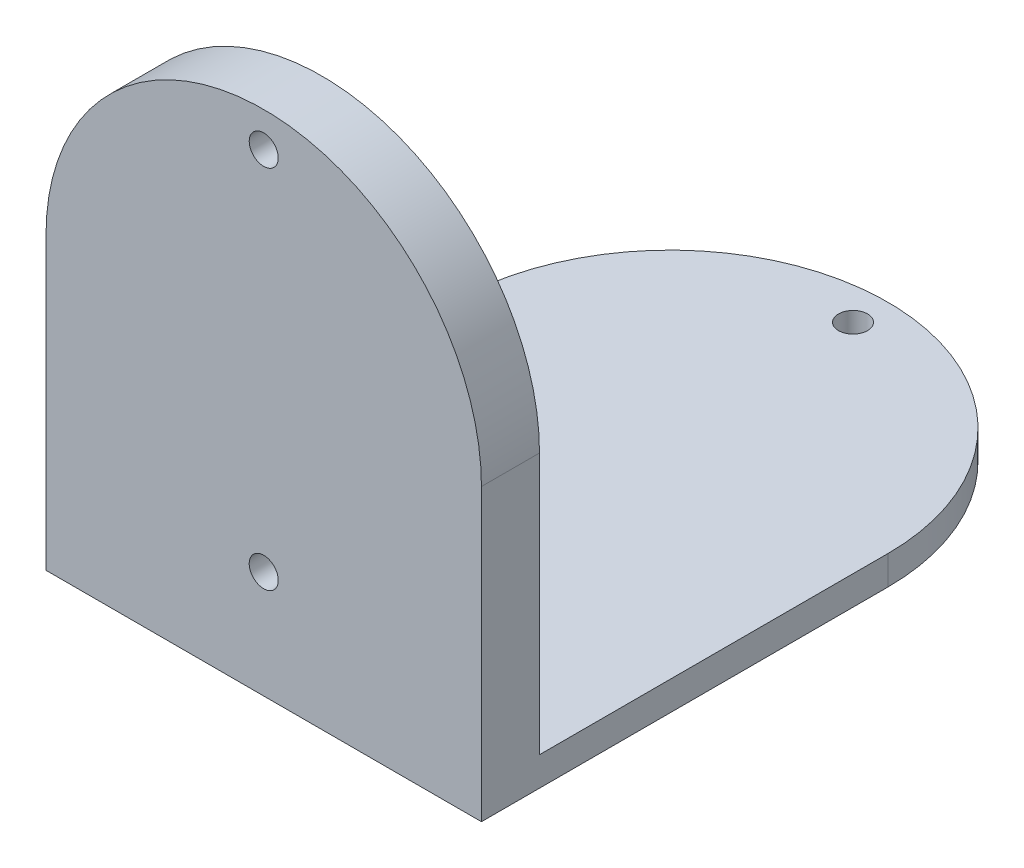
ISO-10303-21;
HEADER;
FILE_DESCRIPTION(('STEP AP214'),'2;1');
FILE_NAME('part.step','',(''),(''),'','','');
FILE_SCHEMA(('AUTOMOTIVE_DESIGN { 1 0 10303 214 1 1 1 1 }'));
ENDSEC;
DATA;
#1=APPLICATION_CONTEXT('core data for automotive mechanical design processes');
#2=APPLICATION_PROTOCOL_DEFINITION('international standard','automotive_design',2000,#1);
#3=PRODUCT_CONTEXT('',#1,'mechanical');
#4=PRODUCT('Part','Part','',(#3));
#5=PRODUCT_RELATED_PRODUCT_CATEGORY('part','',(#4));
#6=PRODUCT_DEFINITION_FORMATION('','',#4);
#7=PRODUCT_DEFINITION_CONTEXT('part definition',#1,'design');
#8=PRODUCT_DEFINITION('design','',#6,#7);
#9=PRODUCT_DEFINITION_SHAPE('','',#8);
#10=(LENGTH_UNIT() NAMED_UNIT(*) SI_UNIT(.MILLI.,.METRE.));
#11=(NAMED_UNIT(*) PLANE_ANGLE_UNIT() SI_UNIT($,.RADIAN.));
#12=(NAMED_UNIT(*) SI_UNIT($,.STERADIAN.) SOLID_ANGLE_UNIT());
#13=UNCERTAINTY_MEASURE_WITH_UNIT(LENGTH_MEASURE(1.E-05),#10,'distance_accuracy_value','');
#14=(GEOMETRIC_REPRESENTATION_CONTEXT(3) GLOBAL_UNCERTAINTY_ASSIGNED_CONTEXT((#13)) GLOBAL_UNIT_ASSIGNED_CONTEXT((#10,
#11,#12)) REPRESENTATION_CONTEXT('',''));
#15=CARTESIAN_POINT('',(0.,0.,0.));
#16=DIRECTION('',(0.,0.,1.));
#17=DIRECTION('',(1.,0.,0.));
#18=AXIS2_PLACEMENT_3D('',#15,#16,#17);
#19=CARTESIAN_POINT('',(0.,5.,0.));
#20=DIRECTION('',(0.,-1.,0.));
#21=DIRECTION('',(0.,0.,-1.));
#22=AXIS2_PLACEMENT_3D('',#19,#20,#21);
#23=PLANE('',#22);
#24=CARTESIAN_POINT('',(0.,5.,-31.5));
#25=DIRECTION('',(0.,1.,0.));
#26=DIRECTION('',(0.,0.,1.));
#27=AXIS2_PLACEMENT_3D('',#24,#25,#26);
#28=CIRCLE('',#27,2.5);
#29=CARTESIAN_POINT('',(0.,5.,-29.));
#30=VERTEX_POINT('',#29);
#31=EDGE_CURVE('E155',#30,#30,#28,.T.);
#32=ORIENTED_EDGE('',*,*,#31,.F.);
#33=EDGE_LOOP('',(#32));
#34=FACE_BOUND('',#33,.T.);
#35=CARTESIAN_POINT('',(0.,5.,31.5));
#36=DIRECTION('',(0.,1.,0.));
#37=DIRECTION('',(0.,0.,-1.));
#38=AXIS2_PLACEMENT_3D('',#35,#36,#37);
#39=CIRCLE('',#38,2.5);
#40=CARTESIAN_POINT('',(0.,5.,29.));
#41=VERTEX_POINT('',#40);
#42=EDGE_CURVE('E163',#41,#41,#39,.T.);
#43=ORIENTED_EDGE('',*,*,#42,.F.);
#44=EDGE_LOOP('',(#43));
#45=FACE_BOUND('',#44,.T.);
#46=DIRECTION('',(-1.,0.,0.));
#47=VECTOR('',#46,1.);
#48=CARTESIAN_POINT('',(-37.5,5.,60.));
#49=LINE('',#48,#47);
#50=CARTESIAN_POINT('',(37.5,5.,60.));
#51=VERTEX_POINT('',#50);
#52=CARTESIAN_POINT('',(-37.5,5.,60.));
#53=VERTEX_POINT('',#52);
#54=EDGE_CURVE('E55',#51,#53,#49,.T.);
#55=ORIENTED_EDGE('',*,*,#54,.F.);
#56=DIRECTION('',(0.,0.,-1.));
#57=VECTOR('',#56,1.);
#58=CARTESIAN_POINT('',(37.5,5.,70.));
#59=LINE('',#58,#57);
#60=CARTESIAN_POINT('',(37.5,5.,0.));
#61=VERTEX_POINT('',#60);
#62=EDGE_CURVE('E60',#51,#61,#59,.T.);
#63=ORIENTED_EDGE('',*,*,#62,.T.);
#64=CARTESIAN_POINT('',(0.,5.,0.));
#65=DIRECTION('',(0.,1.,0.));
#66=DIRECTION('',(0.,0.,-1.));
#67=AXIS2_PLACEMENT_3D('',#64,#65,#66);
#68=CIRCLE('',#67,37.5);
#69=CARTESIAN_POINT('',(-37.5,5.,0.));
#70=VERTEX_POINT('',#69);
#71=EDGE_CURVE('E92',#61,#70,#68,.T.);
#72=ORIENTED_EDGE('',*,*,#71,.T.);
#73=DIRECTION('',(0.,0.,1.));
#74=VECTOR('',#73,1.);
#75=CARTESIAN_POINT('',(-37.5,5.,0.));
#76=LINE('',#75,#74);
#77=EDGE_CURVE('E172',#70,#53,#76,.T.);
#78=ORIENTED_EDGE('',*,*,#77,.T.);
#79=EDGE_LOOP('',(#55,#63,#72,#78));
#80=FACE_BOUND('',#79,.T.);
#81=ADVANCED_FACE('F39',(#34,#45,#80),#23,.F.);
#82=CARTESIAN_POINT('',(0.,5.,0.));
#83=DIRECTION('',(0.,-1.,0.));
#84=DIRECTION('',(0.,0.,-1.));
#85=AXIS2_PLACEMENT_3D('',#82,#83,#84);
#86=CYLINDRICAL_SURFACE('',#85,37.5);
#87=CARTESIAN_POINT('',(0.,0.,0.));
#88=DIRECTION('',(0.,1.,0.));
#89=DIRECTION('',(0.,0.,-1.));
#90=AXIS2_PLACEMENT_3D('',#87,#88,#89);
#91=CIRCLE('',#90,37.5);
#92=CARTESIAN_POINT('',(37.5,0.,0.));
#93=VERTEX_POINT('',#92);
#94=CARTESIAN_POINT('',(-37.5,0.,0.));
#95=VERTEX_POINT('',#94);
#96=EDGE_CURVE('E98',#93,#95,#91,.T.);
#97=ORIENTED_EDGE('',*,*,#96,.T.);
#98=DIRECTION('',(0.,-1.,0.));
#99=VECTOR('',#98,1.);
#100=CARTESIAN_POINT('',(-37.5,5.,0.));
#101=LINE('',#100,#99);
#102=EDGE_CURVE('E11',#70,#95,#101,.T.);
#103=ORIENTED_EDGE('',*,*,#102,.F.);
#104=ORIENTED_EDGE('',*,*,#71,.F.);
#105=DIRECTION('',(0.,-1.,0.));
#106=VECTOR('',#105,1.);
#107=CARTESIAN_POINT('',(37.5,5.,0.));
#108=LINE('',#107,#106);
#109=EDGE_CURVE('E83',#61,#93,#108,.T.);
#110=ORIENTED_EDGE('',*,*,#109,.T.);
#111=EDGE_LOOP('',(#97,#103,#104,#110));
#112=FACE_BOUND('',#111,.T.);
#113=ADVANCED_FACE('F41',(#112),#86,.T.);
#114=CARTESIAN_POINT('',(-37.5,5.,0.));
#115=DIRECTION('',(1.,0.,0.));
#116=DIRECTION('',(0.,0.,-1.));
#117=AXIS2_PLACEMENT_3D('',#114,#115,#116);
#118=PLANE('',#117);
#119=DIRECTION('',(0.,0.,1.));
#120=VECTOR('',#119,1.);
#121=CARTESIAN_POINT('',(-37.5,0.,0.));
#122=LINE('',#121,#120);
#123=CARTESIAN_POINT('',(-37.5,0.,70.));
#124=VERTEX_POINT('',#123);
#125=EDGE_CURVE('E102',#95,#124,#122,.T.);
#126=ORIENTED_EDGE('',*,*,#125,.T.);
#127=DIRECTION('',(0.,-1.,0.));
#128=VECTOR('',#127,1.);
#129=CARTESIAN_POINT('',(-37.5,5.,70.));
#130=LINE('',#129,#128);
#131=CARTESIAN_POINT('',(-37.5,50.,70.));
#132=VERTEX_POINT('',#131);
#133=EDGE_CURVE('E48',#132,#124,#130,.T.);
#134=ORIENTED_EDGE('',*,*,#133,.F.);
#135=DIRECTION('',(0.,0.,1.));
#136=VECTOR('',#135,1.);
#137=CARTESIAN_POINT('',(-37.5,50.,-31.5491671180028));
#138=LINE('',#137,#136);
#139=CARTESIAN_POINT('',(-37.5,50.,60.));
#140=VERTEX_POINT('',#139);
#141=EDGE_CURVE('E133',#140,#132,#138,.T.);
#142=ORIENTED_EDGE('',*,*,#141,.F.);
#143=DIRECTION('',(0.,-1.,0.));
#144=VECTOR('',#143,1.);
#145=CARTESIAN_POINT('',(-37.5,35.,60.));
#146=LINE('',#145,#144);
#147=EDGE_CURVE('E110',#140,#53,#146,.T.);
#148=ORIENTED_EDGE('',*,*,#147,.T.);
#149=ORIENTED_EDGE('',*,*,#77,.F.);
#150=ORIENTED_EDGE('',*,*,#102,.T.);
#151=EDGE_LOOP('',(#126,#134,#142,#148,#149,#150));
#152=FACE_BOUND('',#151,.T.);
#153=ADVANCED_FACE('F130',(#152),#118,.F.);
#154=CARTESIAN_POINT('',(-37.5,5.,70.));
#155=DIRECTION('',(0.,0.,-1.));
#156=DIRECTION('',(-1.,0.,0.));
#157=AXIS2_PLACEMENT_3D('',#154,#155,#156);
#158=PLANE('',#157);
#159=CARTESIAN_POINT('',(0.,81.5,70.));
#160=DIRECTION('',(0.,0.,-1.));
#161=DIRECTION('',(-1.,0.,0.));
#162=AXIS2_PLACEMENT_3D('',#159,#160,#161);
#163=CIRCLE('',#162,2.5);
#164=CARTESIAN_POINT('',(-2.5,81.5,70.));
#165=VERTEX_POINT('',#164);
#166=EDGE_CURVE('E148',#165,#165,#163,.T.);
#167=ORIENTED_EDGE('',*,*,#166,.T.);
#168=EDGE_LOOP('',(#167));
#169=FACE_BOUND('',#168,.T.);
#170=CARTESIAN_POINT('',(0.,18.5,70.));
#171=DIRECTION('',(0.,0.,-1.));
#172=DIRECTION('',(1.,0.,0.));
#173=AXIS2_PLACEMENT_3D('',#170,#171,#172);
#174=CIRCLE('',#173,2.5);
#175=CARTESIAN_POINT('',(2.5,18.5,70.));
#176=VERTEX_POINT('',#175);
#177=EDGE_CURVE('E190',#176,#176,#174,.T.);
#178=ORIENTED_EDGE('',*,*,#177,.T.);
#179=EDGE_LOOP('',(#178));
#180=FACE_BOUND('',#179,.T.);
#181=DIRECTION('',(1.,0.,0.));
#182=VECTOR('',#181,1.);
#183=CARTESIAN_POINT('',(-37.5,0.,70.));
#184=LINE('',#183,#182);
#185=CARTESIAN_POINT('',(37.5,0.,70.));
#186=VERTEX_POINT('',#185);
#187=EDGE_CURVE('E93',#124,#186,#184,.T.);
#188=ORIENTED_EDGE('',*,*,#187,.T.);
#189=DIRECTION('',(0.,-1.,0.));
#190=VECTOR('',#189,1.);
#191=CARTESIAN_POINT('',(37.5,5.,70.));
#192=LINE('',#191,#190);
#193=CARTESIAN_POINT('',(37.5,50.,70.));
#194=VERTEX_POINT('',#193);
#195=EDGE_CURVE('E87',#194,#186,#192,.T.);
#196=ORIENTED_EDGE('',*,*,#195,.F.);
#197=CARTESIAN_POINT('',(0.,50.,70.));
#198=DIRECTION('',(0.,0.,1.));
#199=DIRECTION('',(1.,0.,0.));
#200=AXIS2_PLACEMENT_3D('',#197,#198,#199);
#201=CIRCLE('',#200,37.5);
#202=EDGE_CURVE('E126',#194,#132,#201,.T.);
#203=ORIENTED_EDGE('',*,*,#202,.T.);
#204=ORIENTED_EDGE('',*,*,#133,.T.);
#205=EDGE_LOOP('',(#188,#196,#203,#204));
#206=FACE_BOUND('',#205,.T.);
#207=ADVANCED_FACE('F123',(#169,#180,#206),#158,.F.);
#208=CARTESIAN_POINT('',(37.5,5.,70.));
#209=DIRECTION('',(-1.,0.,0.));
#210=DIRECTION('',(0.,0.,1.));
#211=AXIS2_PLACEMENT_3D('',#208,#209,#210);
#212=PLANE('',#211);
#213=DIRECTION('',(0.,0.,-1.));
#214=VECTOR('',#213,1.);
#215=CARTESIAN_POINT('',(37.5,0.,70.));
#216=LINE('',#215,#214);
#217=EDGE_CURVE('E80',#186,#93,#216,.T.);
#218=ORIENTED_EDGE('',*,*,#217,.T.);
#219=ORIENTED_EDGE('',*,*,#109,.F.);
#220=ORIENTED_EDGE('',*,*,#62,.F.);
#221=DIRECTION('',(0.,-1.,0.));
#222=VECTOR('',#221,1.);
#223=CARTESIAN_POINT('',(37.5,35.,60.));
#224=LINE('',#223,#222);
#225=CARTESIAN_POINT('',(37.5,50.,60.));
#226=VERTEX_POINT('',#225);
#227=EDGE_CURVE('E104',#226,#51,#224,.T.);
#228=ORIENTED_EDGE('',*,*,#227,.F.);
#229=DIRECTION('',(0.,0.,1.));
#230=VECTOR('',#229,1.);
#231=CARTESIAN_POINT('',(37.5,50.,-31.5491671180028));
#232=LINE('',#231,#230);
#233=EDGE_CURVE('E143',#226,#194,#232,.T.);
#234=ORIENTED_EDGE('',*,*,#233,.T.);
#235=ORIENTED_EDGE('',*,*,#195,.T.);
#236=EDGE_LOOP('',(#218,#219,#220,#228,#234,#235));
#237=FACE_BOUND('',#236,.T.);
#238=ADVANCED_FACE('F82',(#237),#212,.F.);
#239=CARTESIAN_POINT('',(0.,0.,0.));
#240=DIRECTION('',(0.,-1.,0.));
#241=DIRECTION('',(0.,0.,-1.));
#242=AXIS2_PLACEMENT_3D('',#239,#240,#241);
#243=PLANE('',#242);
#244=CARTESIAN_POINT('',(0.,0.,-31.5));
#245=DIRECTION('',(0.,1.,0.));
#246=DIRECTION('',(0.,0.,1.));
#247=AXIS2_PLACEMENT_3D('',#244,#245,#246);
#248=CIRCLE('',#247,2.5);
#249=CARTESIAN_POINT('',(0.,0.,-29.));
#250=VERTEX_POINT('',#249);
#251=EDGE_CURVE('E151',#250,#250,#248,.T.);
#252=ORIENTED_EDGE('',*,*,#251,.T.);
#253=EDGE_LOOP('',(#252));
#254=FACE_BOUND('',#253,.T.);
#255=CARTESIAN_POINT('',(0.,0.,31.5));
#256=DIRECTION('',(0.,1.,0.));
#257=DIRECTION('',(0.,0.,-1.));
#258=AXIS2_PLACEMENT_3D('',#255,#256,#257);
#259=CIRCLE('',#258,2.5);
#260=CARTESIAN_POINT('',(0.,0.,29.));
#261=VERTEX_POINT('',#260);
#262=EDGE_CURVE('E159',#261,#261,#259,.T.);
#263=ORIENTED_EDGE('',*,*,#262,.T.);
#264=EDGE_LOOP('',(#263));
#265=FACE_BOUND('',#264,.T.);
#266=ORIENTED_EDGE('',*,*,#96,.F.);
#267=ORIENTED_EDGE('',*,*,#217,.F.);
#268=ORIENTED_EDGE('',*,*,#187,.F.);
#269=ORIENTED_EDGE('',*,*,#125,.F.);
#270=EDGE_LOOP('',(#266,#267,#268,#269));
#271=FACE_BOUND('',#270,.T.);
#272=ADVANCED_FACE('F101',(#254,#265,#271),#243,.T.);
#273=CARTESIAN_POINT('',(-37.5,35.,60.));
#274=DIRECTION('',(0.,0.,1.));
#275=DIRECTION('',(1.,0.,0.));
#276=AXIS2_PLACEMENT_3D('',#273,#274,#275);
#277=PLANE('',#276);
#278=CARTESIAN_POINT('',(0.,81.5,60.));
#279=DIRECTION('',(0.,0.,-1.));
#280=DIRECTION('',(-1.,0.,0.));
#281=AXIS2_PLACEMENT_3D('',#278,#279,#280);
#282=CIRCLE('',#281,2.5);
#283=CARTESIAN_POINT('',(-2.5,81.5,60.));
#284=VERTEX_POINT('',#283);
#285=EDGE_CURVE('E194',#284,#284,#282,.T.);
#286=ORIENTED_EDGE('',*,*,#285,.F.);
#287=EDGE_LOOP('',(#286));
#288=FACE_BOUND('',#287,.T.);
#289=CARTESIAN_POINT('',(0.,18.5,60.));
#290=DIRECTION('',(0.,0.,-1.));
#291=DIRECTION('',(1.,0.,0.));
#292=AXIS2_PLACEMENT_3D('',#289,#290,#291);
#293=CIRCLE('',#292,2.5);
#294=CARTESIAN_POINT('',(2.5,18.5,60.));
#295=VERTEX_POINT('',#294);
#296=EDGE_CURVE('E186',#295,#295,#293,.T.);
#297=ORIENTED_EDGE('',*,*,#296,.F.);
#298=EDGE_LOOP('',(#297));
#299=FACE_BOUND('',#298,.T.);
#300=ORIENTED_EDGE('',*,*,#54,.T.);
#301=ORIENTED_EDGE('',*,*,#147,.F.);
#302=CARTESIAN_POINT('',(0.,50.,60.));
#303=DIRECTION('',(0.,0.,1.));
#304=DIRECTION('',(1.,0.,0.));
#305=AXIS2_PLACEMENT_3D('',#302,#303,#304);
#306=CIRCLE('',#305,37.5);
#307=EDGE_CURVE('E141',#140,#226,#306,.F.);
#308=ORIENTED_EDGE('',*,*,#307,.T.);
#309=ORIENTED_EDGE('',*,*,#227,.T.);
#310=EDGE_LOOP('',(#300,#301,#308,#309));
#311=FACE_BOUND('',#310,.T.);
#312=ADVANCED_FACE('F178',(#288,#299,#311),#277,.F.);
#313=CARTESIAN_POINT('',(0.,0.,31.5));
#314=DIRECTION('',(0.,1.,0.));
#315=DIRECTION('',(0.,0.,1.));
#316=AXIS2_PLACEMENT_3D('',#313,#314,#315);
#317=CYLINDRICAL_SURFACE('',#316,2.5);
#318=ORIENTED_EDGE('',*,*,#262,.F.);
#319=EDGE_LOOP('',(#318));
#320=FACE_BOUND('',#319,.T.);
#321=ORIENTED_EDGE('',*,*,#42,.T.);
#322=EDGE_LOOP('',(#321));
#323=FACE_BOUND('',#322,.T.);
#324=ADVANCED_FACE('F213',(#320,#323),#317,.F.);
#325=CARTESIAN_POINT('',(0.,0.,-31.5));
#326=DIRECTION('',(0.,1.,0.));
#327=DIRECTION('',(0.,0.,1.));
#328=AXIS2_PLACEMENT_3D('',#325,#326,#327);
#329=CYLINDRICAL_SURFACE('',#328,2.5);
#330=ORIENTED_EDGE('',*,*,#251,.F.);
#331=EDGE_LOOP('',(#330));
#332=FACE_BOUND('',#331,.T.);
#333=ORIENTED_EDGE('',*,*,#31,.T.);
#334=EDGE_LOOP('',(#333));
#335=FACE_BOUND('',#334,.T.);
#336=ADVANCED_FACE('F223',(#332,#335),#329,.F.);
#337=CARTESIAN_POINT('',(0.,50.,-31.5491671180028));
#338=DIRECTION('',(0.,0.,1.));
#339=DIRECTION('',(1.,0.,0.));
#340=AXIS2_PLACEMENT_3D('',#337,#338,#339);
#341=CYLINDRICAL_SURFACE('',#340,37.5);
#342=ORIENTED_EDGE('',*,*,#307,.F.);
#343=ORIENTED_EDGE('',*,*,#141,.T.);
#344=ORIENTED_EDGE('',*,*,#202,.F.);
#345=ORIENTED_EDGE('',*,*,#233,.F.);
#346=EDGE_LOOP('',(#342,#343,#344,#345));
#347=FACE_BOUND('',#346,.T.);
#348=ADVANCED_FACE('F138',(#347),#341,.T.);
#349=CARTESIAN_POINT('',(0.,18.5,70.));
#350=DIRECTION('',(0.,0.,-1.));
#351=DIRECTION('',(-1.,0.,0.));
#352=AXIS2_PLACEMENT_3D('',#349,#350,#351);
#353=CYLINDRICAL_SURFACE('',#352,2.5);
#354=ORIENTED_EDGE('',*,*,#177,.F.);
#355=EDGE_LOOP('',(#354));
#356=FACE_BOUND('',#355,.T.);
#357=ORIENTED_EDGE('',*,*,#296,.T.);
#358=EDGE_LOOP('',(#357));
#359=FACE_BOUND('',#358,.T.);
#360=ADVANCED_FACE('F207',(#356,#359),#353,.F.);
#361=CARTESIAN_POINT('',(0.,81.5,70.));
#362=DIRECTION('',(0.,0.,-1.));
#363=DIRECTION('',(-1.,0.,0.));
#364=AXIS2_PLACEMENT_3D('',#361,#362,#363);
#365=CYLINDRICAL_SURFACE('',#364,2.5);
#366=ORIENTED_EDGE('',*,*,#166,.F.);
#367=EDGE_LOOP('',(#366));
#368=FACE_BOUND('',#367,.T.);
#369=ORIENTED_EDGE('',*,*,#285,.T.);
#370=EDGE_LOOP('',(#369));
#371=FACE_BOUND('',#370,.T.);
#372=ADVANCED_FACE('F204',(#368,#371),#365,.F.);
#373=CLOSED_SHELL('',(#81,#113,#153,#207,#238,#272,#312,#324,#336,#348,#360,#372));
#374=MANIFOLD_SOLID_BREP('B2',#373);
#375=ADVANCED_BREP_SHAPE_REPRESENTATION('',(#18,#374),#14);
#376=SHAPE_DEFINITION_REPRESENTATION(#9,#375);
ENDSEC;
END-ISO-10303-21;
